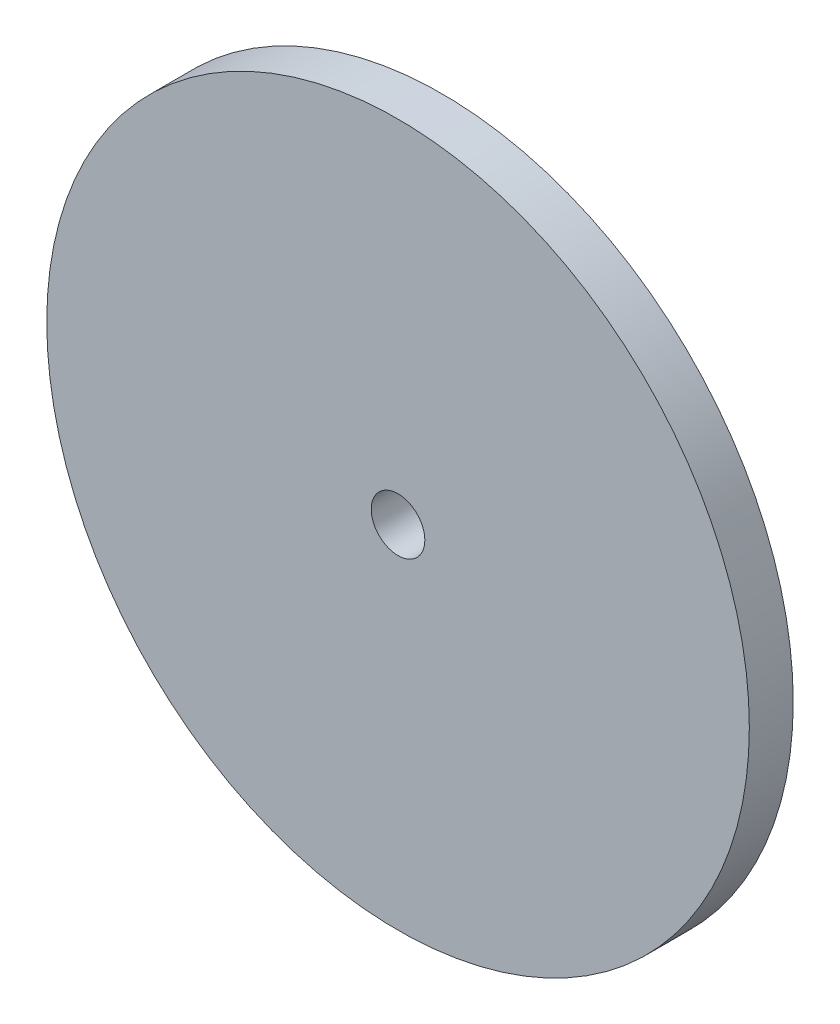
ISO-10303-21;
HEADER;
FILE_DESCRIPTION(('STEP AP214'),'2;1');
FILE_NAME('part.step','',(''),(''),'','','');
FILE_SCHEMA(('AUTOMOTIVE_DESIGN { 1 0 10303 214 1 1 1 1 }'));
ENDSEC;
DATA;
#1=APPLICATION_CONTEXT('core data for automotive mechanical design processes');
#2=APPLICATION_PROTOCOL_DEFINITION('international standard','automotive_design',2000,#1);
#3=PRODUCT_CONTEXT('',#1,'mechanical');
#4=PRODUCT('Part','Part','',(#3));
#5=PRODUCT_RELATED_PRODUCT_CATEGORY('part','',(#4));
#6=PRODUCT_DEFINITION_FORMATION('','',#4);
#7=PRODUCT_DEFINITION_CONTEXT('part definition',#1,'design');
#8=PRODUCT_DEFINITION('design','',#6,#7);
#9=PRODUCT_DEFINITION_SHAPE('','',#8);
#10=(LENGTH_UNIT() NAMED_UNIT(*) SI_UNIT(.MILLI.,.METRE.));
#11=(NAMED_UNIT(*) PLANE_ANGLE_UNIT() SI_UNIT($,.RADIAN.));
#12=(NAMED_UNIT(*) SI_UNIT($,.STERADIAN.) SOLID_ANGLE_UNIT());
#13=UNCERTAINTY_MEASURE_WITH_UNIT(LENGTH_MEASURE(1.E-05),#10,'distance_accuracy_value','');
#14=(GEOMETRIC_REPRESENTATION_CONTEXT(3) GLOBAL_UNCERTAINTY_ASSIGNED_CONTEXT((#13)) GLOBAL_UNIT_ASSIGNED_CONTEXT((#10,
#11,#12)) REPRESENTATION_CONTEXT('',''));
#15=CARTESIAN_POINT('',(0.,0.,0.));
#16=DIRECTION('',(0.,0.,1.));
#17=DIRECTION('',(1.,0.,0.));
#18=AXIS2_PLACEMENT_3D('',#15,#16,#17);
#19=CARTESIAN_POINT('',(0.,0.,5.));
#20=DIRECTION('',(0.,0.,1.));
#21=DIRECTION('',(1.,0.,0.));
#22=AXIS2_PLACEMENT_3D('',#19,#20,#21);
#23=PLANE('',#22);
#24=CARTESIAN_POINT('',(0.,0.,5.));
#25=DIRECTION('',(0.,0.,1.));
#26=DIRECTION('',(1.,0.,0.));
#27=AXIS2_PLACEMENT_3D('',#24,#25,#26);
#28=CIRCLE('',#27,40.);
#29=CARTESIAN_POINT('',(40.,0.,5.));
#30=VERTEX_POINT('',#29);
#31=EDGE_CURVE('E10',#30,#30,#28,.T.);
#32=ORIENTED_EDGE('',*,*,#31,.T.);
#33=EDGE_LOOP('',(#32));
#34=FACE_BOUND('',#33,.T.);
#35=CARTESIAN_POINT('',(0.,0.,5.));
#36=DIRECTION('',(0.,0.,1.));
#37=DIRECTION('',(1.,0.,0.));
#38=AXIS2_PLACEMENT_3D('',#35,#36,#37);
#39=CIRCLE('',#38,3.05);
#40=CARTESIAN_POINT('',(3.05,0.,5.));
#41=VERTEX_POINT('',#40);
#42=EDGE_CURVE('E45',#41,#41,#39,.T.);
#43=ORIENTED_EDGE('',*,*,#42,.F.);
#44=EDGE_LOOP('',(#43));
#45=FACE_BOUND('',#44,.T.);
#46=ADVANCED_FACE('F34',(#34,#45),#23,.T.);
#47=CARTESIAN_POINT('',(0.,0.,0.));
#48=DIRECTION('',(0.,0.,1.));
#49=DIRECTION('',(1.,0.,0.));
#50=AXIS2_PLACEMENT_3D('',#47,#48,#49);
#51=PLANE('',#50);
#52=CARTESIAN_POINT('',(0.,0.,0.));
#53=DIRECTION('',(0.,0.,1.));
#54=DIRECTION('',(1.,0.,0.));
#55=AXIS2_PLACEMENT_3D('',#52,#53,#54);
#56=CIRCLE('',#55,40.);
#57=CARTESIAN_POINT('',(40.,0.,0.));
#58=VERTEX_POINT('',#57);
#59=EDGE_CURVE('E38',#58,#58,#56,.T.);
#60=ORIENTED_EDGE('',*,*,#59,.F.);
#61=EDGE_LOOP('',(#60));
#62=FACE_BOUND('',#61,.T.);
#63=CARTESIAN_POINT('',(0.,0.,0.));
#64=DIRECTION('',(0.,0.,1.));
#65=DIRECTION('',(1.,0.,0.));
#66=AXIS2_PLACEMENT_3D('',#63,#64,#65);
#67=CIRCLE('',#66,3.05);
#68=CARTESIAN_POINT('',(3.05,0.,0.));
#69=VERTEX_POINT('',#68);
#70=EDGE_CURVE('E47',#69,#69,#67,.T.);
#71=ORIENTED_EDGE('',*,*,#70,.T.);
#72=EDGE_LOOP('',(#71));
#73=FACE_BOUND('',#72,.T.);
#74=ADVANCED_FACE('F57',(#62,#73),#51,.F.);
#75=CARTESIAN_POINT('',(0.,0.,5.));
#76=DIRECTION('',(0.,0.,-1.));
#77=DIRECTION('',(-1.,0.,0.));
#78=AXIS2_PLACEMENT_3D('',#75,#76,#77);
#79=CYLINDRICAL_SURFACE('',#78,40.);
#80=ORIENTED_EDGE('',*,*,#31,.F.);
#81=EDGE_LOOP('',(#80));
#82=FACE_BOUND('',#81,.T.);
#83=ORIENTED_EDGE('',*,*,#59,.T.);
#84=EDGE_LOOP('',(#83));
#85=FACE_BOUND('',#84,.T.);
#86=ADVANCED_FACE('F36',(#82,#85),#79,.T.);
#87=CARTESIAN_POINT('',(0.,0.,5.));
#88=DIRECTION('',(0.,0.,-1.));
#89=DIRECTION('',(-1.,0.,0.));
#90=AXIS2_PLACEMENT_3D('',#87,#88,#89);
#91=CYLINDRICAL_SURFACE('',#90,3.05);
#92=ORIENTED_EDGE('',*,*,#42,.T.);
#93=EDGE_LOOP('',(#92));
#94=FACE_BOUND('',#93,.T.);
#95=ORIENTED_EDGE('',*,*,#70,.F.);
#96=EDGE_LOOP('',(#95));
#97=FACE_BOUND('',#96,.T.);
#98=ADVANCED_FACE('F53',(#94,#97),#91,.F.);
#99=CLOSED_SHELL('',(#46,#74,#86,#98));
#100=MANIFOLD_SOLID_BREP('B2',#99);
#101=ADVANCED_BREP_SHAPE_REPRESENTATION('',(#18,#100),#14);
#102=SHAPE_DEFINITION_REPRESENTATION(#9,#101);
ENDSEC;
END-ISO-10303-21;
